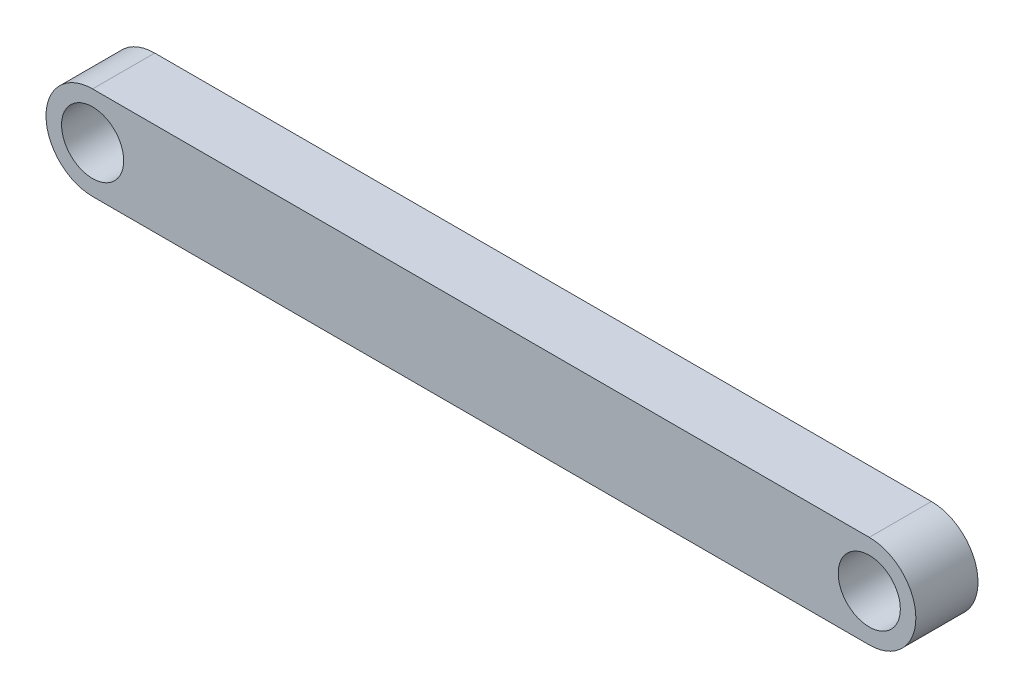
ISO-10303-21;
HEADER;
FILE_DESCRIPTION(('STEP AP214'),'2;1');
FILE_NAME('part.step','',(''),(''),'','','');
FILE_SCHEMA(('AUTOMOTIVE_DESIGN { 1 0 10303 214 1 1 1 1 }'));
ENDSEC;
DATA;
#1=APPLICATION_CONTEXT('core data for automotive mechanical design processes');
#2=APPLICATION_PROTOCOL_DEFINITION('international standard','automotive_design',2000,#1);
#3=PRODUCT_CONTEXT('',#1,'mechanical');
#4=PRODUCT('Part','Part','',(#3));
#5=PRODUCT_RELATED_PRODUCT_CATEGORY('part','',(#4));
#6=PRODUCT_DEFINITION_FORMATION('','',#4);
#7=PRODUCT_DEFINITION_CONTEXT('part definition',#1,'design');
#8=PRODUCT_DEFINITION('design','',#6,#7);
#9=PRODUCT_DEFINITION_SHAPE('','',#8);
#10=(LENGTH_UNIT() NAMED_UNIT(*) SI_UNIT(.MILLI.,.METRE.));
#11=(NAMED_UNIT(*) PLANE_ANGLE_UNIT() SI_UNIT($,.RADIAN.));
#12=(NAMED_UNIT(*) SI_UNIT($,.STERADIAN.) SOLID_ANGLE_UNIT());
#13=UNCERTAINTY_MEASURE_WITH_UNIT(LENGTH_MEASURE(1.E-05),#10,'distance_accuracy_value','');
#14=(GEOMETRIC_REPRESENTATION_CONTEXT(3) GLOBAL_UNCERTAINTY_ASSIGNED_CONTEXT((#13)) GLOBAL_UNIT_ASSIGNED_CONTEXT((#10,
#11,#12)) REPRESENTATION_CONTEXT('',''));
#15=CARTESIAN_POINT('',(0.,0.,0.));
#16=DIRECTION('',(0.,0.,1.));
#17=DIRECTION('',(1.,0.,0.));
#18=AXIS2_PLACEMENT_3D('',#15,#16,#17);
#19=CARTESIAN_POINT('',(-75.,0.,20.));
#20=DIRECTION('',(0.,0.,1.));
#21=DIRECTION('',(1.,0.,0.));
#22=AXIS2_PLACEMENT_3D('',#19,#20,#21);
#23=PLANE('',#22);
#24=CARTESIAN_POINT('',(-75.,0.,20.));
#25=DIRECTION('',(0.,0.,1.));
#26=DIRECTION('',(1.,0.,0.));
#27=AXIS2_PLACEMENT_3D('',#24,#25,#26);
#28=CIRCLE('',#27,10.);
#29=CARTESIAN_POINT('',(-65.,0.,20.));
#30=VERTEX_POINT('',#29);
#31=EDGE_CURVE('E101',#30,#30,#28,.T.);
#32=ORIENTED_EDGE('',*,*,#31,.F.);
#33=EDGE_LOOP('',(#32));
#34=FACE_BOUND('',#33,.T.);
#35=CARTESIAN_POINT('',(-75.,0.,20.));
#36=DIRECTION('',(0.,0.,1.));
#37=DIRECTION('',(1.,0.,0.));
#38=AXIS2_PLACEMENT_3D('',#35,#36,#37);
#39=CIRCLE('',#38,15.);
#40=CARTESIAN_POINT('',(-75.,-15.,20.));
#41=VERTEX_POINT('',#40);
#42=CARTESIAN_POINT('',(-75.,15.,20.));
#43=VERTEX_POINT('',#42);
#44=EDGE_CURVE('E86',#41,#43,#39,.T.);
#45=ORIENTED_EDGE('',*,*,#44,.T.);
#46=DIRECTION('',(-1.,0.,0.));
#47=VECTOR('',#46,1.);
#48=CARTESIAN_POINT('',(-75.,15.,20.));
#49=LINE('',#48,#47);
#50=CARTESIAN_POINT('',(-325.,15.,20.));
#51=VERTEX_POINT('',#50);
#52=EDGE_CURVE('E81',#43,#51,#49,.T.);
#53=ORIENTED_EDGE('',*,*,#52,.T.);
#54=CARTESIAN_POINT('',(-325.,0.,20.));
#55=DIRECTION('',(0.,0.,1.));
#56=DIRECTION('',(1.,0.,0.));
#57=AXIS2_PLACEMENT_3D('',#54,#55,#56);
#58=CIRCLE('',#57,15.);
#59=CARTESIAN_POINT('',(-325.,-15.,20.));
#60=VERTEX_POINT('',#59);
#61=EDGE_CURVE('E84',#51,#60,#58,.T.);
#62=ORIENTED_EDGE('',*,*,#61,.T.);
#63=DIRECTION('',(1.,0.,0.));
#64=VECTOR('',#63,1.);
#65=CARTESIAN_POINT('',(-75.,-15.,20.));
#66=LINE('',#65,#64);
#67=EDGE_CURVE('E51',#60,#41,#66,.T.);
#68=ORIENTED_EDGE('',*,*,#67,.T.);
#69=EDGE_LOOP('',(#45,#53,#62,#68));
#70=FACE_BOUND('',#69,.T.);
#71=CARTESIAN_POINT('',(-325.,0.,20.));
#72=DIRECTION('',(0.,0.,1.));
#73=DIRECTION('',(1.,0.,0.));
#74=AXIS2_PLACEMENT_3D('',#71,#72,#73);
#75=CIRCLE('',#74,9.99999999999998);
#76=CARTESIAN_POINT('',(-315.,0.,20.));
#77=VERTEX_POINT('',#76);
#78=EDGE_CURVE('E116',#77,#77,#75,.T.);
#79=ORIENTED_EDGE('',*,*,#78,.F.);
#80=EDGE_LOOP('',(#79));
#81=FACE_BOUND('',#80,.T.);
#82=ADVANCED_FACE('F34',(#34,#70,#81),#23,.T.);
#83=CARTESIAN_POINT('',(-75.,0.,0.));
#84=DIRECTION('',(0.,0.,1.));
#85=DIRECTION('',(1.,0.,0.));
#86=AXIS2_PLACEMENT_3D('',#83,#84,#85);
#87=PLANE('',#86);
#88=CARTESIAN_POINT('',(-75.,0.,0.));
#89=DIRECTION('',(0.,0.,1.));
#90=DIRECTION('',(1.,0.,0.));
#91=AXIS2_PLACEMENT_3D('',#88,#89,#90);
#92=CIRCLE('',#91,15.);
#93=CARTESIAN_POINT('',(-75.,-15.,0.));
#94=VERTEX_POINT('',#93);
#95=CARTESIAN_POINT('',(-75.,15.,0.));
#96=VERTEX_POINT('',#95);
#97=EDGE_CURVE('E98',#94,#96,#92,.T.);
#98=ORIENTED_EDGE('',*,*,#97,.F.);
#99=DIRECTION('',(1.,0.,0.));
#100=VECTOR('',#99,1.);
#101=CARTESIAN_POINT('',(-75.,-15.,0.));
#102=LINE('',#101,#100);
#103=CARTESIAN_POINT('',(-325.,-15.,0.));
#104=VERTEX_POINT('',#103);
#105=EDGE_CURVE('E74',#104,#94,#102,.T.);
#106=ORIENTED_EDGE('',*,*,#105,.F.);
#107=CARTESIAN_POINT('',(-325.,0.,0.));
#108=DIRECTION('',(0.,0.,1.));
#109=DIRECTION('',(1.,0.,0.));
#110=AXIS2_PLACEMENT_3D('',#107,#108,#109);
#111=CIRCLE('',#110,15.);
#112=CARTESIAN_POINT('',(-325.,15.,0.));
#113=VERTEX_POINT('',#112);
#114=EDGE_CURVE('E68',#113,#104,#111,.T.);
#115=ORIENTED_EDGE('',*,*,#114,.F.);
#116=DIRECTION('',(-1.,0.,0.));
#117=VECTOR('',#116,1.);
#118=CARTESIAN_POINT('',(-75.,15.,0.));
#119=LINE('',#118,#117);
#120=EDGE_CURVE('E90',#96,#113,#119,.T.);
#121=ORIENTED_EDGE('',*,*,#120,.F.);
#122=EDGE_LOOP('',(#98,#106,#115,#121));
#123=FACE_BOUND('',#122,.T.);
#124=CARTESIAN_POINT('',(-75.,0.,0.));
#125=DIRECTION('',(0.,0.,1.));
#126=DIRECTION('',(1.,0.,0.));
#127=AXIS2_PLACEMENT_3D('',#124,#125,#126);
#128=CIRCLE('',#127,10.);
#129=CARTESIAN_POINT('',(-65.,0.,0.));
#130=VERTEX_POINT('',#129);
#131=EDGE_CURVE('E113',#130,#130,#128,.T.);
#132=ORIENTED_EDGE('',*,*,#131,.T.);
#133=EDGE_LOOP('',(#132));
#134=FACE_BOUND('',#133,.T.);
#135=CARTESIAN_POINT('',(-325.,0.,0.));
#136=DIRECTION('',(0.,0.,1.));
#137=DIRECTION('',(1.,0.,0.));
#138=AXIS2_PLACEMENT_3D('',#135,#136,#137);
#139=CIRCLE('',#138,9.99999999999998);
#140=CARTESIAN_POINT('',(-315.,0.,0.));
#141=VERTEX_POINT('',#140);
#142=EDGE_CURVE('E119',#141,#141,#139,.T.);
#143=ORIENTED_EDGE('',*,*,#142,.T.);
#144=EDGE_LOOP('',(#143));
#145=FACE_BOUND('',#144,.T.);
#146=ADVANCED_FACE('F109',(#123,#134,#145),#87,.F.);
#147=CARTESIAN_POINT('',(-75.,0.,20.));
#148=DIRECTION('',(0.,0.,-1.));
#149=DIRECTION('',(-1.,0.,0.));
#150=AXIS2_PLACEMENT_3D('',#147,#148,#149);
#151=CYLINDRICAL_SURFACE('',#150,15.);
#152=ORIENTED_EDGE('',*,*,#97,.T.);
#153=DIRECTION('',(0.,0.,-1.));
#154=VECTOR('',#153,1.);
#155=CARTESIAN_POINT('',(-75.,15.,20.));
#156=LINE('',#155,#154);
#157=EDGE_CURVE('E11',#43,#96,#156,.T.);
#158=ORIENTED_EDGE('',*,*,#157,.F.);
#159=ORIENTED_EDGE('',*,*,#44,.F.);
#160=DIRECTION('',(0.,0.,-1.));
#161=VECTOR('',#160,1.);
#162=CARTESIAN_POINT('',(-75.,-15.,20.));
#163=LINE('',#162,#161);
#164=EDGE_CURVE('E94',#41,#94,#163,.T.);
#165=ORIENTED_EDGE('',*,*,#164,.T.);
#166=EDGE_LOOP('',(#152,#158,#159,#165));
#167=FACE_BOUND('',#166,.T.);
#168=ADVANCED_FACE('F36',(#167),#151,.T.);
#169=CARTESIAN_POINT('',(-75.,15.,20.));
#170=DIRECTION('',(0.,-1.,0.));
#171=DIRECTION('',(1.,0.,0.));
#172=AXIS2_PLACEMENT_3D('',#169,#170,#171);
#173=PLANE('',#172);
#174=ORIENTED_EDGE('',*,*,#120,.T.);
#175=DIRECTION('',(0.,0.,-1.));
#176=VECTOR('',#175,1.);
#177=CARTESIAN_POINT('',(-325.,15.,20.));
#178=LINE('',#177,#176);
#179=EDGE_CURVE('E43',#51,#113,#178,.T.);
#180=ORIENTED_EDGE('',*,*,#179,.F.);
#181=ORIENTED_EDGE('',*,*,#52,.F.);
#182=ORIENTED_EDGE('',*,*,#157,.T.);
#183=EDGE_LOOP('',(#174,#180,#181,#182));
#184=FACE_BOUND('',#183,.T.);
#185=ADVANCED_FACE('F89',(#184),#173,.F.);
#186=CARTESIAN_POINT('',(-325.,0.,20.));
#187=DIRECTION('',(0.,0.,-1.));
#188=DIRECTION('',(-1.,0.,0.));
#189=AXIS2_PLACEMENT_3D('',#186,#187,#188);
#190=CYLINDRICAL_SURFACE('',#189,15.);
#191=ORIENTED_EDGE('',*,*,#114,.T.);
#192=DIRECTION('',(0.,0.,-1.));
#193=VECTOR('',#192,1.);
#194=CARTESIAN_POINT('',(-325.,-15.,20.));
#195=LINE('',#194,#193);
#196=EDGE_CURVE('E91',#60,#104,#195,.T.);
#197=ORIENTED_EDGE('',*,*,#196,.F.);
#198=ORIENTED_EDGE('',*,*,#61,.F.);
#199=ORIENTED_EDGE('',*,*,#179,.T.);
#200=EDGE_LOOP('',(#191,#197,#198,#199));
#201=FACE_BOUND('',#200,.T.);
#202=ADVANCED_FACE('F92',(#201),#190,.T.);
#203=CARTESIAN_POINT('',(-75.,-15.,20.));
#204=DIRECTION('',(0.,1.,0.));
#205=DIRECTION('',(-1.,0.,0.));
#206=AXIS2_PLACEMENT_3D('',#203,#204,#205);
#207=PLANE('',#206);
#208=ORIENTED_EDGE('',*,*,#105,.T.);
#209=ORIENTED_EDGE('',*,*,#164,.F.);
#210=ORIENTED_EDGE('',*,*,#67,.F.);
#211=ORIENTED_EDGE('',*,*,#196,.T.);
#212=EDGE_LOOP('',(#208,#209,#210,#211));
#213=FACE_BOUND('',#212,.T.);
#214=ADVANCED_FACE('F106',(#213),#207,.F.);
#215=CARTESIAN_POINT('',(-75.,0.,20.));
#216=DIRECTION('',(0.,0.,-1.));
#217=DIRECTION('',(-1.,0.,0.));
#218=AXIS2_PLACEMENT_3D('',#215,#216,#217);
#219=CYLINDRICAL_SURFACE('',#218,10.);
#220=ORIENTED_EDGE('',*,*,#31,.T.);
#221=EDGE_LOOP('',(#220));
#222=FACE_BOUND('',#221,.T.);
#223=ORIENTED_EDGE('',*,*,#131,.F.);
#224=EDGE_LOOP('',(#223));
#225=FACE_BOUND('',#224,.T.);
#226=ADVANCED_FACE('F136',(#222,#225),#219,.F.);
#227=CARTESIAN_POINT('',(-325.,0.,20.));
#228=DIRECTION('',(0.,0.,-1.));
#229=DIRECTION('',(-1.,0.,0.));
#230=AXIS2_PLACEMENT_3D('',#227,#228,#229);
#231=CYLINDRICAL_SURFACE('',#230,9.99999999999998);
#232=ORIENTED_EDGE('',*,*,#78,.T.);
#233=EDGE_LOOP('',(#232));
#234=FACE_BOUND('',#233,.T.);
#235=ORIENTED_EDGE('',*,*,#142,.F.);
#236=EDGE_LOOP('',(#235));
#237=FACE_BOUND('',#236,.T.);
#238=ADVANCED_FACE('F125',(#234,#237),#231,.F.);
#239=CLOSED_SHELL('',(#82,#146,#168,#185,#202,#214,#226,#238));
#240=MANIFOLD_SOLID_BREP('B2',#239);
#241=ADVANCED_BREP_SHAPE_REPRESENTATION('',(#18,#240),#14);
#242=SHAPE_DEFINITION_REPRESENTATION(#9,#241);
ENDSEC;
END-ISO-10303-21;
